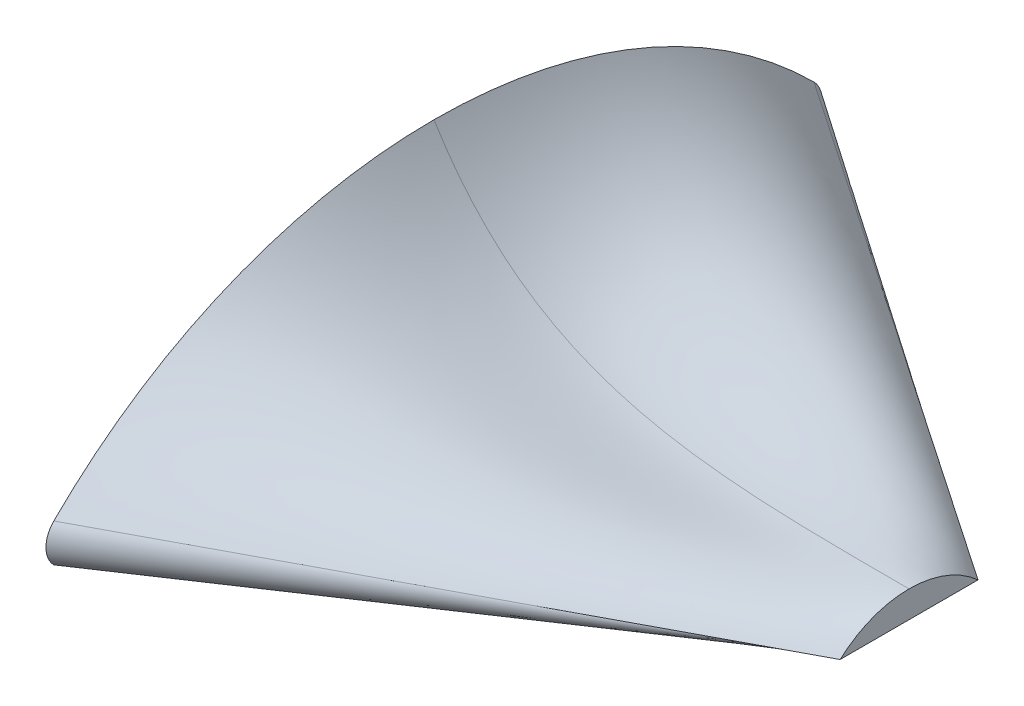
ISO-10303-21;
HEADER;
FILE_DESCRIPTION(('STEP AP214'),'2;1');
FILE_NAME('part.step','',(''),(''),'','','');
FILE_SCHEMA(('AUTOMOTIVE_DESIGN { 1 0 10303 214 1 1 1 1 }'));
ENDSEC;
DATA;
#1=APPLICATION_CONTEXT('core data for automotive mechanical design processes');
#2=APPLICATION_PROTOCOL_DEFINITION('international standard','automotive_design',2000,#1);
#3=PRODUCT_CONTEXT('',#1,'mechanical');
#4=PRODUCT('Part','Part','',(#3));
#5=PRODUCT_RELATED_PRODUCT_CATEGORY('part','',(#4));
#6=PRODUCT_DEFINITION_FORMATION('','',#4);
#7=PRODUCT_DEFINITION_CONTEXT('part definition',#1,'design');
#8=PRODUCT_DEFINITION('design','',#6,#7);
#9=PRODUCT_DEFINITION_SHAPE('','',#8);
#10=(LENGTH_UNIT() NAMED_UNIT(*) SI_UNIT(.MILLI.,.METRE.));
#11=(NAMED_UNIT(*) PLANE_ANGLE_UNIT() SI_UNIT($,.RADIAN.));
#12=(NAMED_UNIT(*) SI_UNIT($,.STERADIAN.) SOLID_ANGLE_UNIT());
#13=UNCERTAINTY_MEASURE_WITH_UNIT(LENGTH_MEASURE(1.E-05),#10,'distance_accuracy_value','');
#14=(GEOMETRIC_REPRESENTATION_CONTEXT(3) GLOBAL_UNCERTAINTY_ASSIGNED_CONTEXT((#13)) GLOBAL_UNIT_ASSIGNED_CONTEXT((#10,
#11,#12)) REPRESENTATION_CONTEXT('',''));
#15=CARTESIAN_POINT('',(0.,0.,0.));
#16=DIRECTION('',(0.,0.,1.));
#17=DIRECTION('',(1.,0.,0.));
#18=AXIS2_PLACEMENT_3D('',#15,#16,#17);
#19=CARTESIAN_POINT('',(50.,-7.94965417671036,-39.9995951025209));
#20=DIRECTION('',(1.,0.,0.));
#21=DIRECTION('',(0.,0.,-1.));
#22=AXIS2_PLACEMENT_3D('',#19,#20,#21);
#23=PLANE('',#22);
#24=CARTESIAN_POINT('',(50.,-7.94965417671036,-39.9995951025209));
#25=DIRECTION('',(1.,0.,0.));
#26=DIRECTION('',(0.,0.,-1.));
#27=AXIS2_PLACEMENT_3D('',#24,#25,#26);
#28=CIRCLE('',#27,10.7622558801957);
#29=CARTESIAN_POINT('',(50.,0.,-47.2541902050417));
#30=VERTEX_POINT('',#29);
#31=CARTESIAN_POINT('',(50.,2.81260169586887,-40.0000000000008));
#32=VERTEX_POINT('',#31);
#33=EDGE_CURVE('E158',#30,#32,#28,.T.);
#34=ORIENTED_EDGE('',*,*,#33,.T.);
#35=CARTESIAN_POINT('',(50.,0.,-32.745));
#36=VERTEX_POINT('',#35);
#37=EDGE_CURVE('E387',#32,#36,#28,.T.);
#38=ORIENTED_EDGE('',*,*,#37,.T.);
#39=DIRECTION('',(0.,0.,-1.));
#40=VECTOR('',#39,1.);
#41=CARTESIAN_POINT('',(50.,0.,-32.745));
#42=LINE('',#41,#40);
#43=CARTESIAN_POINT('',(50.,0.,-33.4045454545455));
#44=VERTEX_POINT('',#43);
#45=EDGE_CURVE('E13',#36,#44,#42,.T.);
#46=ORIENTED_EDGE('',*,*,#45,.T.);
#47=CARTESIAN_POINT('',(50.,0.,-46.5947183682197));
#48=VERTEX_POINT('',#47);
#49=EDGE_CURVE('E150',#44,#48,#42,.T.);
#50=ORIENTED_EDGE('',*,*,#49,.T.);
#51=EDGE_CURVE('E357',#48,#30,#42,.T.);
#52=ORIENTED_EDGE('',*,*,#51,.T.);
#53=EDGE_LOOP('',(#34,#38,#46,#50,#52));
#54=FACE_BOUND('',#53,.T.);
#55=ADVANCED_FACE('F139',(#54),#23,.T.);
#56=CARTESIAN_POINT('',(0.,2.,-2.));
#57=DIRECTION('',(-1.,0.,0.));
#58=DIRECTION('',(0.,0.,1.));
#59=AXIS2_PLACEMENT_3D('',#56,#57,#58);
#60=PLANE('',#59);
#61=CARTESIAN_POINT('',(0.,4.99999999999999,-40.));
#62=DIRECTION('',(-1.,0.,0.));
#63=DIRECTION('',(0.,0.,1.));
#64=AXIS2_PLACEMENT_3D('',#61,#62,#63);
#65=CIRCLE('',#64,4.);
#66=CARTESIAN_POINT('',(0.,4.99999999999999,-36.));
#67=VERTEX_POINT('',#66);
#68=EDGE_CURVE('E487',#67,#67,#65,.T.);
#69=ORIENTED_EDGE('',*,*,#68,.F.);
#70=EDGE_LOOP('',(#69));
#71=FACE_BOUND('',#70,.T.);
#72=CARTESIAN_POINT('',(0.,2.,-2.));
#73=DIRECTION('',(1.,0.,0.));
#74=DIRECTION('',(0.,0.,1.));
#75=AXIS2_PLACEMENT_3D('',#72,#73,#74);
#76=CIRCLE('',#75,2.82842712474619);
#77=CARTESIAN_POINT('',(0.,4.,0.));
#78=VERTEX_POINT('',#77);
#79=CARTESIAN_POINT('',(0.,0.,0.));
#80=VERTEX_POINT('',#79);
#81=EDGE_CURVE('E196',#78,#80,#76,.T.);
#82=ORIENTED_EDGE('',*,*,#81,.F.);
#83=CARTESIAN_POINT('',(0.,-36.0000000000002,-40.));
#84=DIRECTION('',(1.,0.,0.));
#85=DIRECTION('',(0.,0.,1.));
#86=AXIS2_PLACEMENT_3D('',#83,#84,#85);
#87=CIRCLE('',#86,56.5685424949239);
#88=CARTESIAN_POINT('',(0.,20.5685424949238,-40.));
#89=VERTEX_POINT('',#88);
#90=EDGE_CURVE('E215',#89,#78,#87,.T.);
#91=ORIENTED_EDGE('',*,*,#90,.F.);
#92=CARTESIAN_POINT('',(0.,3.99999999999999,-80.));
#93=VERTEX_POINT('',#92);
#94=EDGE_CURVE('E416',#93,#89,#87,.T.);
#95=ORIENTED_EDGE('',*,*,#94,.F.);
#96=CARTESIAN_POINT('',(0.,2.,-78.));
#97=DIRECTION('',(1.,0.,0.));
#98=DIRECTION('',(0.,0.,-1.));
#99=AXIS2_PLACEMENT_3D('',#96,#97,#98);
#100=CIRCLE('',#99,2.8284271247462);
#101=CARTESIAN_POINT('',(0.,0.,-80.));
#102=VERTEX_POINT('',#101);
#103=EDGE_CURVE('E199',#102,#93,#100,.T.);
#104=ORIENTED_EDGE('',*,*,#103,.F.);
#105=DIRECTION('',(0.,0.,-1.));
#106=VECTOR('',#105,1.);
#107=CARTESIAN_POINT('',(0.,0.,0.));
#108=LINE('',#107,#106);
#109=EDGE_CURVE('E191',#80,#102,#108,.T.);
#110=ORIENTED_EDGE('',*,*,#109,.F.);
#111=EDGE_LOOP('',(#82,#91,#95,#104,#110));
#112=FACE_BOUND('',#111,.T.);
#113=ADVANCED_FACE('F194',(#71,#112),#60,.T.);
#114=CARTESIAN_POINT('',(0.,3.99999999999999,-80.));
#115=CARTESIAN_POINT('',(16.6666666666667,2.66666666666666,-69.0847300683473));
#116=CARTESIAN_POINT('',(33.3333333333333,1.33333333333333,-58.1694601366945));
#117=CARTESIAN_POINT('',(50.,0.,-47.2541902050417));
#118=CARTESIAN_POINT('',(0.,6.63904405261519,-77.3609559473848));
#119=CARTESIAN_POINT('',(16.6666666666667,4.57394141092913,-67.1632839463743));
#120=CARTESIAN_POINT('',(33.3333333333333,2.50883876924307,-56.9656119453637));
#121=CARTESIAN_POINT('',(50.,0.443736127557011,-46.7679399443531));
#122=CARTESIAN_POINT('',(0.,11.3720944633804,-71.5812116978277));
#123=CARTESIAN_POINT('',(15.950170355026,6.51788597364558,-62.9574696470849));
#124=CARTESIAN_POINT('',(32.629103556807,3.88093649349558,-54.3337275963421));
#125=CARTESIAN_POINT('',(50.,1.245103807066,-45.7099855455994));
#126=CARTESIAN_POINT('',(0.,16.6162347407487,-61.7420127961851));
#127=CARTESIAN_POINT('',(13.8006814201041,5.87642750944805,-55.8014690698099));
#128=CARTESIAN_POINT('',(30.5164142272278,4.00565631648663,-49.8609253434348));
#129=CARTESIAN_POINT('',(50.,2.13935229840692,-43.9203816170601));
#130=CARTESIAN_POINT('',(0.,19.8401866065488,-51.0920119199332));
#131=CARTESIAN_POINT('',(11.6511924851822,3.7734502946322,-48.058931934915));
#132=CARTESIAN_POINT('',(28.4037248976486,3.22752704980928,-45.0258519498969));
#133=CARTESIAN_POINT('',(50.,2.68942136102937,-41.9927719648795));
#134=CARTESIAN_POINT('',(0.,20.5685424949238,-43.7023061077576));
#135=CARTESIAN_POINT('',(10.9346961735416,2.8215150380922,-42.6893373185495));
#136=CARTESIAN_POINT('',(27.6994951211223,2.81257236123952,-41.6763685293058));
#137=CARTESIAN_POINT('',(50.,2.8125767374507,-40.6633997403421));
#138=CARTESIAN_POINT('',(0.,20.5685424949238,-40.));
#139=CARTESIAN_POINT('',(10.9346961735416,2.82153606086535,-40.));
#140=CARTESIAN_POINT('',(27.6994951211223,2.81260170348539,-40.));
#141=CARTESIAN_POINT('',(50.,2.81260169586887,-40.0000000000008));
#142=B_SPLINE_SURFACE_WITH_KNOTS('',3,3,((#114,#115,#116,#117),(#118,#119,#120,#121),(#122,#123,
#124,#125),(#126,#127,#128,#129),(#130,#131,#132,#133),(#134,#135,#136,#137),(#138,#139,#140,
#141)),.UNSPECIFIED.,.F.,.F.,.F.,(4,1,1,1,4),(4,4),(0.744223091094177,0.808167318320632,
0.872111545547088,0.936055772773544,1.),(0.,1.),.UNSPECIFIED.);
#143=CARTESIAN_POINT('',(0.,20.5685424949238,-40.));
#144=CARTESIAN_POINT('',(10.9346961735416,2.82153606086535,-40.));
#145=CARTESIAN_POINT('',(27.6994951211223,2.81260170348539,-40.));
#146=CARTESIAN_POINT('',(50.,2.81260169586887,-40.0000000000008));
#147=B_SPLINE_CURVE_WITH_KNOTS('',3,(#143,#144,#145,#146),.UNSPECIFIED.,.F.,.F.,(4,4),(0.,1.),.UNSPECIFIED.);
#148=EDGE_CURVE('E403',#89,#32,#147,.T.);
#149=CARTESIAN_POINT('',(0.,3.99999999999999,-80.));
#150=CARTESIAN_POINT('',(16.6666666666667,2.66666666666666,-69.0847300683473));
#151=CARTESIAN_POINT('',(33.3333333333333,1.33333333333333,-58.1694601366945));
#152=CARTESIAN_POINT('',(50.,0.,-47.2541902050417));
#153=B_SPLINE_CURVE_WITH_KNOTS('',3,(#149,#150,#151,#152),.UNSPECIFIED.,.F.,.F.,(4,4),(0.,1.),.UNSPECIFIED.);
#154=EDGE_CURVE('E222',#93,#30,#153,.T.);
#155=ORIENTED_EDGE('',*,*,#94,.T.);
#156=ORIENTED_EDGE('',*,*,#148,.T.);
#157=ORIENTED_EDGE('',*,*,#33,.F.);
#158=ORIENTED_EDGE('',*,*,#154,.F.);
#159=EDGE_LOOP('',(#155,#156,#157,#158));
#160=FACE_BOUND('',#159,.T.);
#161=ADVANCED_FACE('F264',(#160),#142,.T.);
#162=CARTESIAN_POINT('',(0.,0.,-80.));
#163=CARTESIAN_POINT('',(16.6666666666667,0.,-68.8649061227399));
#164=CARTESIAN_POINT('',(33.3333333333333,0.,-57.7298122454798));
#165=CARTESIAN_POINT('',(50.,0.,-46.5947183682197));
#166=CARTESIAN_POINT('',(0.,0.261799386095722,-80.2617993860957));
#167=CARTESIAN_POINT('',(16.6666666666667,0.174532924063815,-69.0577577089377));
#168=CARTESIAN_POINT('',(33.3333333333333,0.0872664620319073,-57.8537160317796));
#169=CARTESIAN_POINT('',(50.,0.,-46.6496743546216));
#170=CARTESIAN_POINT('',(0.,0.889345576944907,-80.681300868557));
#171=CARTESIAN_POINT('',(16.6666666666667,0.592897051296605,-69.3740626881798));
#172=CARTESIAN_POINT('',(33.3333333333334,0.296448525648302,-58.0668245078025));
#173=CARTESIAN_POINT('',(50.0000000000001,0.,-46.7595863274253));
#174=CARTESIAN_POINT('',(0.,2.,-80.9021203978851));
#175=CARTESIAN_POINT('',(16.6666666666667,1.33333333333334,-69.5762316941336));
#176=CARTESIAN_POINT('',(33.3333333333333,0.666666666666668,-58.2503429903822));
#177=CARTESIAN_POINT('',(50.,0.,-46.9244542866307));
#178=CARTESIAN_POINT('',(0.,3.1106544230551,-80.6813008685571));
#179=CARTESIAN_POINT('',(16.6666666666667,2.07376961537007,-69.4839746609834));
#180=CARTESIAN_POINT('',(33.3333333333334,1.03688480768503,-58.2866484534099));
#181=CARTESIAN_POINT('',(50.0000000000001,0.,-47.0893222458363));
#182=CARTESIAN_POINT('',(0.,3.73820061390428,-80.2617993860957));
#183=CARTESIAN_POINT('',(16.6666666666667,2.49213374260285,-69.2409443302771));
#184=CARTESIAN_POINT('',(33.3333333333333,1.24606687130143,-58.2200892744585));
#185=CARTESIAN_POINT('',(50.,0.,-47.1992342186399));
#186=CARTESIAN_POINT('',(0.,3.99999999999999,-80.));
#187=CARTESIAN_POINT('',(16.6666666666667,2.66666666666666,-69.0847300683473));
#188=CARTESIAN_POINT('',(33.3333333333333,1.33333333333333,-58.1694601366945));
#189=CARTESIAN_POINT('',(50.,0.,-47.2541902050417));
#190=B_SPLINE_SURFACE_WITH_KNOTS('',3,3,((#162,#163,#164,#165),(#166,#167,#168,#169),(#170,#171,
#172,#173),(#174,#175,#176,#177),(#178,#179,#180,#181),(#182,#183,#184,#185),(#186,#187,#188,
#189)),.UNSPECIFIED.,.F.,.F.,.F.,(4,1,1,1,4),(4,4),(0.72088961147396,0.726722981379014,
0.732556351284068,0.738389721189122,0.744223091094177),(0.,1.),.UNSPECIFIED.);
#191=CARTESIAN_POINT('',(0.,0.,-80.));
#192=CARTESIAN_POINT('',(16.6666666666667,0.,-68.8649061227399));
#193=CARTESIAN_POINT('',(33.3333333333333,0.,-57.7298122454798));
#194=CARTESIAN_POINT('',(50.,0.,-46.5947183682197));
#195=B_SPLINE_CURVE_WITH_KNOTS('',3,(#191,#192,#193,#194),.UNSPECIFIED.,.F.,.F.,(4,4),(0.,1.),.UNSPECIFIED.);
#196=EDGE_CURVE('E220',#102,#48,#195,.T.);
#197=ORIENTED_EDGE('',*,*,#103,.T.);
#198=ORIENTED_EDGE('',*,*,#154,.T.);
#199=ORIENTED_EDGE('',*,*,#51,.F.);
#200=ORIENTED_EDGE('',*,*,#196,.F.);
#201=EDGE_LOOP('',(#197,#198,#199,#200));
#202=FACE_BOUND('',#201,.T.);
#203=ADVANCED_FACE('F252',(#202),#190,.T.);
#204=CARTESIAN_POINT('',(0.,0.,0.));
#205=DIRECTION('',(0.,-1.,0.));
#206=DIRECTION('',(0.,0.,-1.));
#207=AXIS2_PLACEMENT_3D('',#204,#205,#206);
#208=PLANE('',#207);
#209=ORIENTED_EDGE('',*,*,#109,.T.);
#210=ORIENTED_EDGE('',*,*,#196,.T.);
#211=ORIENTED_EDGE('',*,*,#49,.F.);
#212=CARTESIAN_POINT('',(0.,0.,0.));
#213=CARTESIAN_POINT('',(16.6666666666667,0.,-11.1348484848485));
#214=CARTESIAN_POINT('',(33.3333333333333,0.,-22.269696969697));
#215=CARTESIAN_POINT('',(50.,0.,-33.4045454545455));
#216=B_SPLINE_CURVE_WITH_KNOTS('',3,(#212,#213,#214,#215),.UNSPECIFIED.,.F.,.F.,(4,4),(0.,1.),.UNSPECIFIED.);
#217=EDGE_CURVE('E214',#80,#44,#216,.T.);
#218=ORIENTED_EDGE('',*,*,#217,.F.);
#219=EDGE_LOOP('',(#209,#210,#211,#218));
#220=FACE_BOUND('',#219,.T.);
#221=ADVANCED_FACE('F141',(#220),#208,.T.);
#222=CARTESIAN_POINT('',(0.,4.,0.));
#223=CARTESIAN_POINT('',(16.6666666666667,2.66666666666667,-10.915));
#224=CARTESIAN_POINT('',(33.3333333333333,1.33333333333333,-21.83));
#225=CARTESIAN_POINT('',(50.,0.,-32.745));
#226=CARTESIAN_POINT('',(0.,3.73820061390428,0.261799386095719));
#227=CARTESIAN_POINT('',(16.6666666666667,2.49213374260285,-10.7587877830069));
#228=CARTESIAN_POINT('',(33.3333333333333,1.24606687130143,-21.7793749521095));
#229=CARTESIAN_POINT('',(50.,0.,-32.7999621212121));
#230=CARTESIAN_POINT('',(0.,3.11065442305509,0.681300868557217));
#231=CARTESIAN_POINT('',(16.6666666666667,2.07376961537006,-10.515761542174));
#232=CARTESIAN_POINT('',(33.3333333333333,1.03688480768503,-21.7128239529052));
#233=CARTESIAN_POINT('',(50.,0.,-32.9098863636364));
#234=CARTESIAN_POINT('',(0.,2.00000000000001,0.902120397884772));
#235=CARTESIAN_POINT('',(16.6666666666667,1.33333333333334,-10.4235106438344));
#236=CARTESIAN_POINT('',(33.3333333333334,0.666666666666669,-21.7491416855535));
#237=CARTESIAN_POINT('',(50.0000000000001,0.,-33.0747727272727));
#238=CARTESIAN_POINT('',(0.,0.889345576944917,0.681300868557222));
#239=CARTESIAN_POINT('',(16.6666666666667,0.592897051296611,-10.6256857845982));
#240=CARTESIAN_POINT('',(33.3333333333333,0.296448525648306,-21.9326724377537));
#241=CARTESIAN_POINT('',(50.,0.,-33.2396590909091));
#242=CARTESIAN_POINT('',(0.,0.261799386095723,0.261799386095723));
#243=CARTESIAN_POINT('',(16.6666666666667,0.174532924063816,-10.941994853714));
#244=CARTESIAN_POINT('',(33.3333333333333,0.0872664620319078,-22.1457890935236));
#245=CARTESIAN_POINT('',(50.,0.,-33.3495833333333));
#246=CARTESIAN_POINT('',(0.,0.,0.));
#247=CARTESIAN_POINT('',(16.6666666666667,0.,-11.1348484848485));
#248=CARTESIAN_POINT('',(33.3333333333333,0.,-22.269696969697));
#249=CARTESIAN_POINT('',(50.,0.,-33.4045454545455));
#250=B_SPLINE_SURFACE_WITH_KNOTS('',3,3,((#222,#223,#224,#225),(#226,#227,#228,#229),(#230,#231,
#232,#233),(#234,#235,#236,#237),(#238,#239,#240,#241),(#242,#243,#244,#245),(#246,#247,#248,
#249)),.UNSPECIFIED.,.F.,.F.,.F.,(4,1,1,1,4),(4,4),(0.25579021424713,0.261623886546305,
0.26745755884548,0.273291231144654,0.279124903443829),(0.,1.),.UNSPECIFIED.);
#251=CARTESIAN_POINT('',(0.,4.,0.));
#252=CARTESIAN_POINT('',(16.6666666666667,2.66666666666667,-10.915));
#253=CARTESIAN_POINT('',(33.3333333333333,1.33333333333333,-21.83));
#254=CARTESIAN_POINT('',(50.,0.,-32.745));
#255=B_SPLINE_CURVE_WITH_KNOTS('',3,(#251,#252,#253,#254),.UNSPECIFIED.,.F.,.F.,(4,4),(0.,1.),.UNSPECIFIED.);
#256=EDGE_CURVE('E205',#78,#36,#255,.T.);
#257=ORIENTED_EDGE('',*,*,#81,.T.);
#258=ORIENTED_EDGE('',*,*,#217,.T.);
#259=ORIENTED_EDGE('',*,*,#45,.F.);
#260=ORIENTED_EDGE('',*,*,#256,.F.);
#261=EDGE_LOOP('',(#257,#258,#259,#260));
#262=FACE_BOUND('',#261,.T.);
#263=ADVANCED_FACE('F213',(#262),#250,.T.);
#264=CARTESIAN_POINT('',(0.,20.5685424949238,-40.));
#265=CARTESIAN_POINT('',(10.9346961735416,2.82153606086535,-40.));
#266=CARTESIAN_POINT('',(27.6994951211223,2.81260170348539,-40.));
#267=CARTESIAN_POINT('',(50.,2.81260169586887,-40.0000000000008));
#268=CARTESIAN_POINT('',(0.,20.5685424949238,-36.29750130079));
#269=CARTESIAN_POINT('',(10.9346961735416,2.82155708473209,-37.3105227839474));
#270=CARTESIAN_POINT('',(27.6994951211223,2.81263104725763,-38.3235442671403));
#271=CARTESIAN_POINT('',(50.,2.81262665558536,-39.336565750055));
#272=CARTESIAN_POINT('',(0.,19.8401154170973,-28.9076076647471));
#273=CARTESIAN_POINT('',(11.6511924851822,3.77349912754999,-31.9407658074633));
#274=CARTESIAN_POINT('',(28.4037248976487,3.22764508925137,-34.9739239502745));
#275=CARTESIAN_POINT('',(50.,2.68955779115078,-38.0070820917047));
#276=CARTESIAN_POINT('',(0.,16.6161034559092,-18.2577004009495));
#277=CARTESIAN_POINT('',(13.8006814201041,5.87644148107349,-24.1982113167752));
#278=CARTESIAN_POINT('',(30.5164142272278,4.0057742567029,-30.1387222326782));
#279=CARTESIAN_POINT('',(50.,2.13953291933999,-36.0792331474589));
#280=CARTESIAN_POINT('',(0.,11.3720276768218,-8.41871476285649));
#281=CARTESIAN_POINT('',(15.950170355026,6.51789703159561,-17.04227102525));
#282=CARTESIAN_POINT('',(32.629103556807,3.88101269199295,-25.6658272876672));
#283=CARTESIAN_POINT('',(50.,1.24523244214948,-34.2893835497392));
#284=CARTESIAN_POINT('',(0.,6.63904409246962,-2.63904409246963));
#285=CARTESIAN_POINT('',(16.6666666666667,4.57395659823565,-12.836462761822));
#286=CARTESIAN_POINT('',(33.3333333333333,2.50886910400167,-23.0338814311744));
#287=CARTESIAN_POINT('',(50.,0.443781609767695,-33.2313001005268));
#288=CARTESIAN_POINT('',(0.,4.,0.));
#289=CARTESIAN_POINT('',(16.6666666666667,2.66666666666667,-10.915));
#290=CARTESIAN_POINT('',(33.3333333333333,1.33333333333333,-21.83));
#291=CARTESIAN_POINT('',(50.,0.,-32.745));
#292=B_SPLINE_SURFACE_WITH_KNOTS('',3,3,((#264,#265,#266,#267),(#268,#269,#270,#271),(#272,#273,
#274,#275),(#276,#277,#278,#279),(#280,#281,#282,#283),(#284,#285,#286,#287),(#288,#289,#290,
#291)),.UNSPECIFIED.,.F.,.F.,.F.,(4,1,1,1,4),(4,4),(0.,0.0639475535617826,0.127895107123565,
0.191842660685348,0.25579021424713),(0.,1.),.UNSPECIFIED.);
#293=ORIENTED_EDGE('',*,*,#90,.T.);
#294=ORIENTED_EDGE('',*,*,#256,.T.);
#295=ORIENTED_EDGE('',*,*,#37,.F.);
#296=ORIENTED_EDGE('',*,*,#148,.F.);
#297=EDGE_LOOP('',(#293,#294,#295,#296));
#298=FACE_BOUND('',#297,.T.);
#299=ADVANCED_FACE('F317',(#298),#292,.T.);
#300=CARTESIAN_POINT('',(-1.,4.99999999999999,-40.));
#301=DIRECTION('',(1.,0.,0.));
#302=DIRECTION('',(0.,0.,-1.));
#303=AXIS2_PLACEMENT_3D('',#300,#301,#302);
#304=CYLINDRICAL_SURFACE('',#303,4.);
#305=CARTESIAN_POINT('',(-1.,4.99999999999999,-40.));
#306=DIRECTION('',(-1.,0.,0.));
#307=DIRECTION('',(0.,0.,1.));
#308=AXIS2_PLACEMENT_3D('',#305,#306,#307);
#309=CIRCLE('',#308,4.);
#310=CARTESIAN_POINT('',(-1.,4.99999999999999,-36.));
#311=VERTEX_POINT('',#310);
#312=EDGE_CURVE('E216',#311,#311,#309,.T.);
#313=ORIENTED_EDGE('',*,*,#312,.F.);
#314=EDGE_LOOP('',(#313));
#315=FACE_BOUND('',#314,.T.);
#316=ORIENTED_EDGE('',*,*,#68,.T.);
#317=EDGE_LOOP('',(#316));
#318=FACE_BOUND('',#317,.T.);
#319=ADVANCED_FACE('F328',(#315,#318),#304,.T.);
#320=CARTESIAN_POINT('',(-1.,4.99999999999999,-40.));
#321=DIRECTION('',(-1.,0.,0.));
#322=DIRECTION('',(0.,0.,1.));
#323=AXIS2_PLACEMENT_3D('',#320,#321,#322);
#324=PLANE('',#323);
#325=ORIENTED_EDGE('',*,*,#312,.T.);
#326=EDGE_LOOP('',(#325));
#327=FACE_BOUND('',#326,.T.);
#328=ADVANCED_FACE('F493',(#327),#324,.T.);
#329=CLOSED_SHELL('',(#55,#113,#161,#203,#221,#263,#299,#319,#328));
#330=MANIFOLD_SOLID_BREP('B2',#329);
#331=ADVANCED_BREP_SHAPE_REPRESENTATION('',(#18,#330),#14);
#332=SHAPE_DEFINITION_REPRESENTATION(#9,#331);
ENDSEC;
END-ISO-10303-21;
